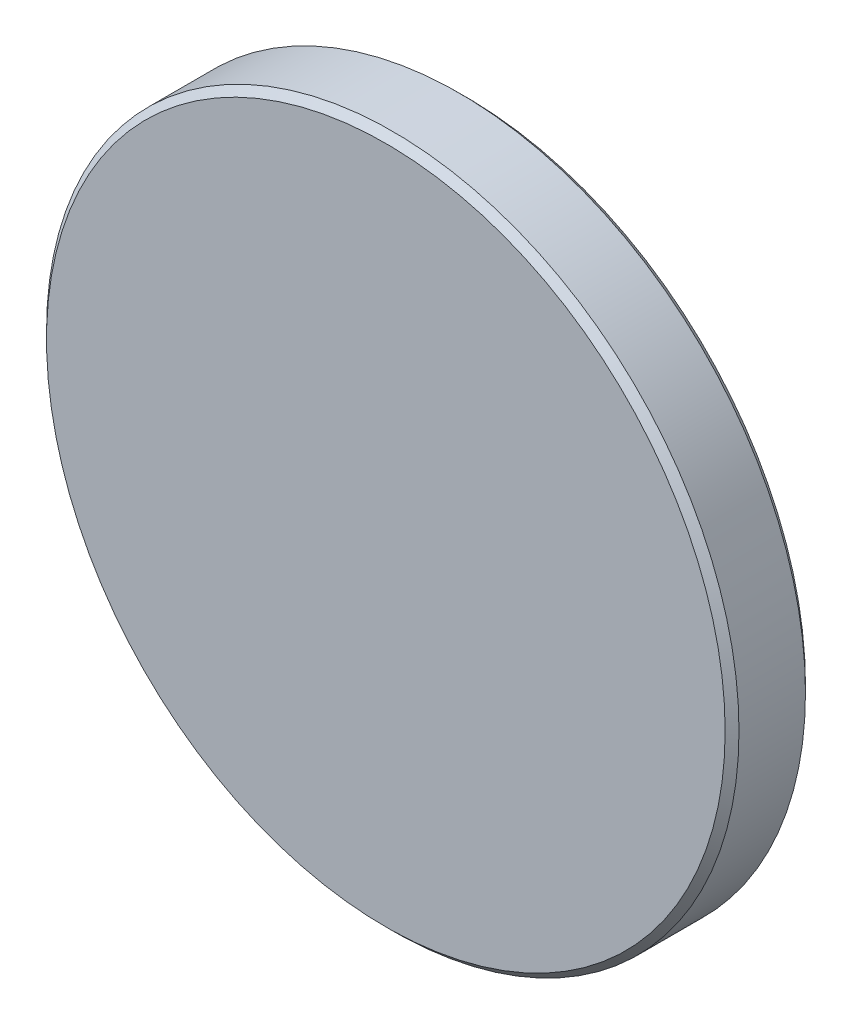
ISO-10303-21;
HEADER;
FILE_DESCRIPTION(('STEP AP214'),'2;1');
FILE_NAME('part.step','',(''),(''),'','','');
FILE_SCHEMA(('AUTOMOTIVE_DESIGN { 1 0 10303 214 1 1 1 1 }'));
ENDSEC;
DATA;
#1=APPLICATION_CONTEXT('core data for automotive mechanical design processes');
#2=APPLICATION_PROTOCOL_DEFINITION('international standard','automotive_design',2000,#1);
#3=PRODUCT_CONTEXT('',#1,'mechanical');
#4=PRODUCT('Part','Part','',(#3));
#5=PRODUCT_RELATED_PRODUCT_CATEGORY('part','',(#4));
#6=PRODUCT_DEFINITION_FORMATION('','',#4);
#7=PRODUCT_DEFINITION_CONTEXT('part definition',#1,'design');
#8=PRODUCT_DEFINITION('design','',#6,#7);
#9=PRODUCT_DEFINITION_SHAPE('','',#8);
#10=(LENGTH_UNIT() NAMED_UNIT(*) SI_UNIT(.MILLI.,.METRE.));
#11=(NAMED_UNIT(*) PLANE_ANGLE_UNIT() SI_UNIT($,.RADIAN.));
#12=(NAMED_UNIT(*) SI_UNIT($,.STERADIAN.) SOLID_ANGLE_UNIT());
#13=UNCERTAINTY_MEASURE_WITH_UNIT(LENGTH_MEASURE(1.E-05),#10,'distance_accuracy_value','');
#14=(GEOMETRIC_REPRESENTATION_CONTEXT(3) GLOBAL_UNCERTAINTY_ASSIGNED_CONTEXT((#13)) GLOBAL_UNIT_ASSIGNED_CONTEXT((#10,
#11,#12)) REPRESENTATION_CONTEXT('',''));
#15=CARTESIAN_POINT('',(0.,0.,0.));
#16=DIRECTION('',(0.,0.,1.));
#17=DIRECTION('',(1.,0.,0.));
#18=AXIS2_PLACEMENT_3D('',#15,#16,#17);
#19=CARTESIAN_POINT('',(0.,0.,2.9));
#20=DIRECTION('',(0.,0.,-1.));
#21=DIRECTION('',(-1.,0.,0.));
#22=AXIS2_PLACEMENT_3D('',#19,#20,#21);
#23=CYLINDRICAL_SURFACE('',#22,12.5);
#24=CARTESIAN_POINT('',(0.,0.,0.25));
#25=DIRECTION('',(0.,0.,1.));
#26=DIRECTION('',(1.,0.,0.));
#27=AXIS2_PLACEMENT_3D('',#24,#25,#26);
#28=CIRCLE('',#27,12.5);
#29=CARTESIAN_POINT('',(12.5,0.,0.25));
#30=VERTEX_POINT('',#29);
#31=EDGE_CURVE('E50',#30,#30,#28,.T.);
#32=ORIENTED_EDGE('',*,*,#31,.T.);
#33=EDGE_LOOP('',(#32));
#34=FACE_BOUND('',#33,.T.);
#35=CARTESIAN_POINT('',(0.,0.,2.65));
#36=DIRECTION('',(0.,0.,1.));
#37=DIRECTION('',(1.,0.,0.));
#38=AXIS2_PLACEMENT_3D('',#35,#36,#37);
#39=CIRCLE('',#38,12.5);
#40=CARTESIAN_POINT('',(12.5,0.,2.65));
#41=VERTEX_POINT('',#40);
#42=EDGE_CURVE('E55',#41,#41,#39,.F.);
#43=ORIENTED_EDGE('',*,*,#42,.T.);
#44=EDGE_LOOP('',(#43));
#45=FACE_BOUND('',#44,.T.);
#46=ADVANCED_FACE('F41',(#34,#45),#23,.T.);
#47=CARTESIAN_POINT('',(0.,0.,2.9));
#48=DIRECTION('',(0.,0.,1.));
#49=DIRECTION('',(1.,0.,0.));
#50=AXIS2_PLACEMENT_3D('',#47,#48,#49);
#51=PLANE('',#50);
#52=CARTESIAN_POINT('',(0.,0.,2.9));
#53=DIRECTION('',(0.,0.,1.));
#54=DIRECTION('',(1.,0.,0.));
#55=AXIS2_PLACEMENT_3D('',#52,#53,#54);
#56=CIRCLE('',#55,12.25);
#57=CARTESIAN_POINT('',(12.25,0.,2.9));
#58=VERTEX_POINT('',#57);
#59=EDGE_CURVE('E60',#58,#58,#56,.T.);
#60=ORIENTED_EDGE('',*,*,#59,.T.);
#61=EDGE_LOOP('',(#60));
#62=FACE_BOUND('',#61,.T.);
#63=ADVANCED_FACE('F67',(#62),#51,.T.);
#64=CARTESIAN_POINT('',(0.,0.,0.));
#65=DIRECTION('',(0.,0.,1.));
#66=DIRECTION('',(1.,0.,0.));
#67=AXIS2_PLACEMENT_3D('',#64,#65,#66);
#68=PLANE('',#67);
#69=CARTESIAN_POINT('',(0.,0.,0.));
#70=DIRECTION('',(0.,0.,1.));
#71=DIRECTION('',(1.,0.,0.));
#72=AXIS2_PLACEMENT_3D('',#69,#70,#71);
#73=CIRCLE('',#72,12.25);
#74=CARTESIAN_POINT('',(12.25,0.,0.));
#75=VERTEX_POINT('',#74);
#76=EDGE_CURVE('E10',#75,#75,#73,.F.);
#77=ORIENTED_EDGE('',*,*,#76,.T.);
#78=EDGE_LOOP('',(#77));
#79=FACE_BOUND('',#78,.T.);
#80=ADVANCED_FACE('F71',(#79),#68,.F.);
#81=CARTESIAN_POINT('',(0.,0.,2.9));
#82=DIRECTION('',(0.,0.,-1.));
#83=DIRECTION('',(-1.,0.,0.));
#84=AXIS2_PLACEMENT_3D('',#81,#82,#83);
#85=CONICAL_SURFACE('',#84,12.25,0.785398163397459);
#86=ORIENTED_EDGE('',*,*,#42,.F.);
#87=EDGE_LOOP('',(#86));
#88=FACE_BOUND('',#87,.T.);
#89=ORIENTED_EDGE('',*,*,#59,.F.);
#90=EDGE_LOOP('',(#89));
#91=FACE_BOUND('',#90,.T.);
#92=ADVANCED_FACE('F69',(#88,#91),#85,.T.);
#93=CARTESIAN_POINT('',(0.,0.,0.25));
#94=DIRECTION('',(0.,0.,1.));
#95=DIRECTION('',(1.,0.,0.));
#96=AXIS2_PLACEMENT_3D('',#93,#94,#95);
#97=CONICAL_SURFACE('',#96,12.5,0.785398163397448);
#98=ORIENTED_EDGE('',*,*,#76,.F.);
#99=EDGE_LOOP('',(#98));
#100=FACE_BOUND('',#99,.T.);
#101=ORIENTED_EDGE('',*,*,#31,.F.);
#102=EDGE_LOOP('',(#101));
#103=FACE_BOUND('',#102,.T.);
#104=ADVANCED_FACE('F44',(#100,#103),#97,.T.);
#105=CLOSED_SHELL('',(#46,#63,#80,#92,#104));
#106=MANIFOLD_SOLID_BREP('B2',#105);
#107=ADVANCED_BREP_SHAPE_REPRESENTATION('',(#18,#106),#14);
#108=SHAPE_DEFINITION_REPRESENTATION(#9,#107);
ENDSEC;
END-ISO-10303-21;
